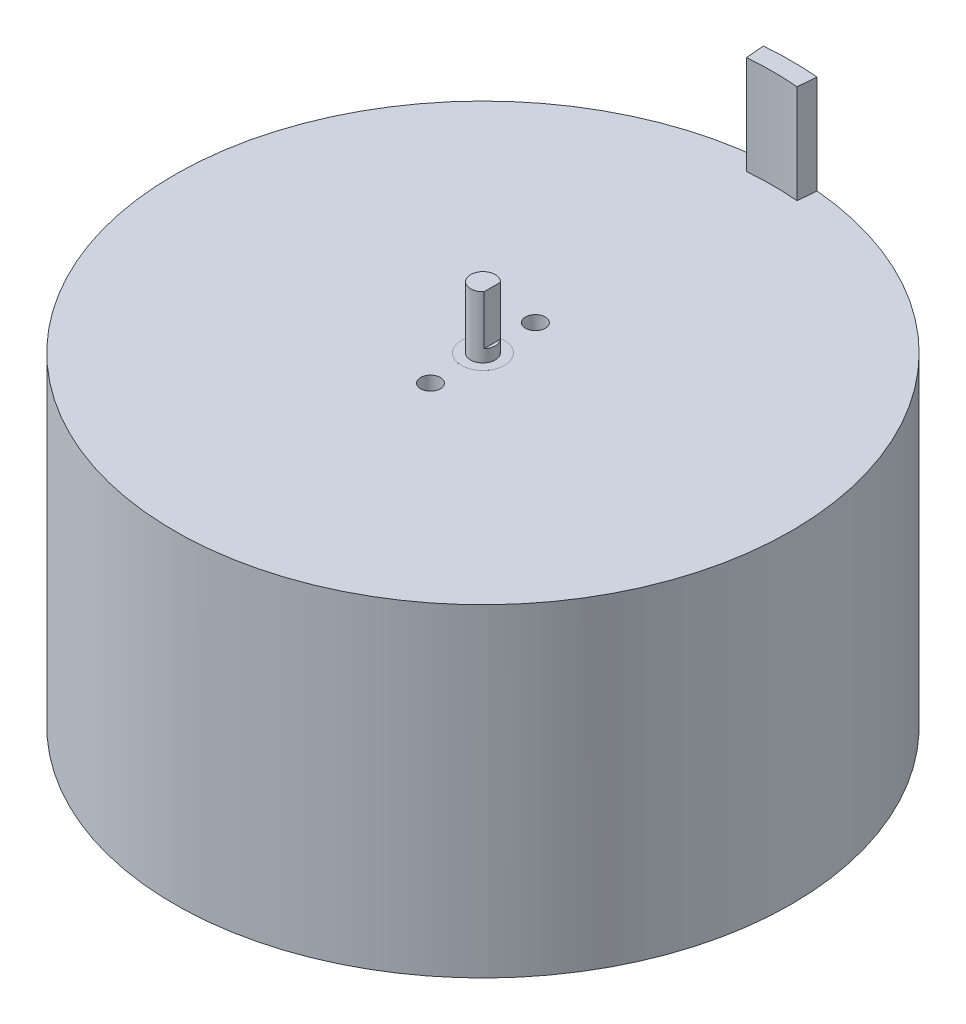
ISO-10303-21;
HEADER;
FILE_DESCRIPTION(('STEP AP214'),'2;1');
FILE_NAME('part.step','',(''),(''),'','','');
FILE_SCHEMA(('AUTOMOTIVE_DESIGN { 1 0 10303 214 1 1 1 1 }'));
ENDSEC;
DATA;
#1=APPLICATION_CONTEXT('core data for automotive mechanical design processes');
#2=APPLICATION_PROTOCOL_DEFINITION('international standard','automotive_design',2000,#1);
#3=PRODUCT_CONTEXT('',#1,'mechanical');
#4=PRODUCT('Part','Part','',(#3));
#5=PRODUCT_RELATED_PRODUCT_CATEGORY('part','',(#4));
#6=PRODUCT_DEFINITION_FORMATION('','',#4);
#7=PRODUCT_DEFINITION_CONTEXT('part definition',#1,'design');
#8=PRODUCT_DEFINITION('design','',#6,#7);
#9=PRODUCT_DEFINITION_SHAPE('','',#8);
#10=(LENGTH_UNIT() NAMED_UNIT(*) SI_UNIT(.MILLI.,.METRE.));
#11=(NAMED_UNIT(*) PLANE_ANGLE_UNIT() SI_UNIT($,.RADIAN.));
#12=(NAMED_UNIT(*) SI_UNIT($,.STERADIAN.) SOLID_ANGLE_UNIT());
#13=UNCERTAINTY_MEASURE_WITH_UNIT(LENGTH_MEASURE(1.E-05),#10,'distance_accuracy_value','');
#14=(GEOMETRIC_REPRESENTATION_CONTEXT(3) GLOBAL_UNCERTAINTY_ASSIGNED_CONTEXT((#13)) GLOBAL_UNIT_ASSIGNED_CONTEXT((#10,
#11,#12)) REPRESENTATION_CONTEXT('',''));
#15=CARTESIAN_POINT('',(0.,0.,0.));
#16=DIRECTION('',(0.,0.,1.));
#17=DIRECTION('',(1.,0.,0.));
#18=AXIS2_PLACEMENT_3D('',#15,#16,#17);
#19=CARTESIAN_POINT('',(-3.50000000000016,45.4,0.));
#20=DIRECTION('',(0.,1.,0.));
#21=DIRECTION('',(-1.,0.,0.));
#22=AXIS2_PLACEMENT_3D('',#19,#20,#21);
#23=PLANE('',#22);
#24=CARTESIAN_POINT('',(-1.58513252783478E-13,45.4,0.));
#25=DIRECTION('',(0.,1.,0.));
#26=DIRECTION('',(1.,0.,0.));
#27=AXIS2_PLACEMENT_3D('',#24,#25,#26);
#28=CIRCLE('',#27,3.5);
#29=CARTESIAN_POINT('',(3.49999999999984,45.4,0.));
#30=VERTEX_POINT('',#29);
#31=EDGE_CURVE('P0_E20',#30,#30,#28,.T.);
#32=ORIENTED_EDGE('',*,*,#31,.F.);
#33=EDGE_LOOP('',(#32));
#34=FACE_BOUND('',#33,.T.);
#35=CARTESIAN_POINT('',(-2.14225111316348E-13,45.4,8.5));
#36=DIRECTION('',(0.,1.,0.));
#37=DIRECTION('',(1.,0.,0.));
#38=AXIS2_PLACEMENT_3D('',#35,#36,#37);
#39=CIRCLE('',#38,1.6);
#40=CARTESIAN_POINT('',(1.59999999999979,45.4,8.5));
#41=VERTEX_POINT('',#40);
#42=EDGE_CURVE('P0_E93',#41,#41,#39,.T.);
#43=ORIENTED_EDGE('',*,*,#42,.F.);
#44=EDGE_LOOP('',(#43));
#45=FACE_BOUND('',#44,.T.);
#46=CARTESIAN_POINT('',(-1.62156577010942E-13,45.4,-8.5));
#47=DIRECTION('',(0.,1.,0.));
#48=DIRECTION('',(1.,0.,0.));
#49=AXIS2_PLACEMENT_3D('',#46,#47,#48);
#50=CIRCLE('',#49,1.6);
#51=CARTESIAN_POINT('',(1.59999999999984,45.4,-8.5));
#52=VERTEX_POINT('',#51);
#53=EDGE_CURVE('P0_E96',#52,#52,#50,.T.);
#54=ORIENTED_EDGE('',*,*,#53,.F.);
#55=EDGE_LOOP('',(#54));
#56=FACE_BOUND('',#55,.T.);
#57=DIRECTION('',(0.0871557427476586,0.,0.996194698091746));
#58=VECTOR('',#57,1.);
#59=CARTESIAN_POINT('',(-1.57649191618767E-13,45.4,0.));
#60=LINE('',#59,#58);
#61=CARTESIAN_POINT('',(-4.35778713738309,45.4,-49.8097349045873));
#62=VERTEX_POINT('',#61);
#63=CARTESIAN_POINT('',(-4.09631990914011,45.4,-46.821150810312));
#64=VERTEX_POINT('',#63);
#65=EDGE_CURVE('P0_E38',#62,#64,#60,.T.);
#66=ORIENTED_EDGE('',*,*,#65,.F.);
#67=CARTESIAN_POINT('',(-1.58513252783478E-13,45.4,0.));
#68=DIRECTION('',(0.,1.,0.));
#69=DIRECTION('',(1.,0.,0.));
#70=AXIS2_PLACEMENT_3D('',#67,#68,#69);
#71=CIRCLE('',#70,50.);
#72=CARTESIAN_POINT('',(4.35778713738277,45.4,-49.8097349045873));
#73=VERTEX_POINT('',#72);
#74=EDGE_CURVE('P0_E25',#62,#73,#71,.T.);
#75=ORIENTED_EDGE('',*,*,#74,.T.);
#76=DIRECTION('',(-0.0871557427476586,0.,0.996194698091746));
#77=VECTOR('',#76,1.);
#78=CARTESIAN_POINT('',(-1.5937731394819E-13,45.4,0.));
#79=LINE('',#78,#77);
#80=CARTESIAN_POINT('',(4.0963199091398,45.4,-46.821150810312));
#81=VERTEX_POINT('',#80);
#82=EDGE_CURVE('P0_E77',#73,#81,#79,.T.);
#83=ORIENTED_EDGE('',*,*,#82,.T.);
#84=CARTESIAN_POINT('',(-1.58513252783478E-13,45.4,0.));
#85=DIRECTION('',(0.,1.,0.));
#86=DIRECTION('',(1.,0.,0.));
#87=AXIS2_PLACEMENT_3D('',#84,#85,#86);
#88=CIRCLE('',#87,47.);
#89=EDGE_CURVE('P0_E33',#64,#81,#88,.F.);
#90=ORIENTED_EDGE('',*,*,#89,.F.);
#91=EDGE_LOOP('',(#66,#75,#83,#90));
#92=FACE_BOUND('',#91,.T.);
#93=ADVANCED_FACE('P0_F16',(#34,#45,#56,#92),#23,.T.);
#94=CARTESIAN_POINT('',(-1.50133697570255E-13,43.,0.));
#95=DIRECTION('',(0.,1.,0.));
#96=DIRECTION('',(1.,0.,0.));
#97=AXIS2_PLACEMENT_3D('',#94,#95,#96);
#98=PLANE('',#97);
#99=CARTESIAN_POINT('',(-1.50133697570255E-13,43.,0.));
#100=DIRECTION('',(0.,1.,0.));
#101=DIRECTION('',(1.,0.,0.));
#102=AXIS2_PLACEMENT_3D('',#99,#100,#101);
#103=CIRCLE('',#102,3.5);
#104=CARTESIAN_POINT('',(3.49999999999985,43.,0.));
#105=VERTEX_POINT('',#104);
#106=EDGE_CURVE('P0_E92',#105,#105,#103,.T.);
#107=ORIENTED_EDGE('',*,*,#106,.T.);
#108=EDGE_LOOP('',(#107));
#109=FACE_BOUND('',#108,.T.);
#110=CARTESIAN_POINT('',(-1.53777021797718E-13,43.,-8.5));
#111=DIRECTION('',(0.,1.,0.));
#112=DIRECTION('',(1.,0.,0.));
#113=AXIS2_PLACEMENT_3D('',#110,#111,#112);
#114=CIRCLE('',#113,1.6);
#115=CARTESIAN_POINT('',(1.59999999999985,43.,-8.5));
#116=VERTEX_POINT('',#115);
#117=EDGE_CURVE('P0_E102',#116,#116,#114,.T.);
#118=ORIENTED_EDGE('',*,*,#117,.T.);
#119=EDGE_LOOP('',(#118));
#120=FACE_BOUND('',#119,.T.);
#121=CARTESIAN_POINT('',(-2.05845556103125E-13,43.,8.5));
#122=DIRECTION('',(0.,1.,0.));
#123=DIRECTION('',(1.,0.,0.));
#124=AXIS2_PLACEMENT_3D('',#121,#122,#123);
#125=CIRCLE('',#124,1.6);
#126=CARTESIAN_POINT('',(1.59999999999979,43.,8.5));
#127=VERTEX_POINT('',#126);
#128=EDGE_CURVE('P0_E99',#127,#127,#125,.T.);
#129=ORIENTED_EDGE('',*,*,#128,.T.);
#130=EDGE_LOOP('',(#129));
#131=FACE_BOUND('',#130,.T.);
#132=CARTESIAN_POINT('',(-1.50133697570255E-13,43.,0.));
#133=DIRECTION('',(0.,1.,0.));
#134=DIRECTION('',(1.,0.,0.));
#135=AXIS2_PLACEMENT_3D('',#132,#133,#134);
#136=CIRCLE('',#135,17.5);
#137=CARTESIAN_POINT('',(17.4999999999999,43.0000000000001,0.));
#138=VERTEX_POINT('',#137);
#139=EDGE_CURVE('P0_E10',#138,#138,#136,.T.);
#140=ORIENTED_EDGE('',*,*,#139,.F.);
#141=EDGE_LOOP('',(#140));
#142=FACE_BOUND('',#141,.T.);
#143=ADVANCED_FACE('P0_F107',(#109,#120,#131,#142),#98,.F.);
#144=CARTESIAN_POINT('',(-6.55926603227395E-13,186.821356237309,-8.5));
#145=DIRECTION('',(0.,-1.,0.));
#146=DIRECTION('',(-1.,0.,0.));
#147=AXIS2_PLACEMENT_3D('',#144,#145,#146);
#148=CYLINDRICAL_SURFACE('',#147,1.6);
#149=ORIENTED_EDGE('',*,*,#117,.F.);
#150=EDGE_LOOP('',(#149));
#151=FACE_BOUND('',#150,.T.);
#152=ORIENTED_EDGE('',*,*,#53,.T.);
#153=EDGE_LOOP('',(#152));
#154=FACE_BOUND('',#153,.T.);
#155=ADVANCED_FACE('P0_F125',(#151,#154),#148,.F.);
#156=CARTESIAN_POINT('',(-7.07995137532801E-13,186.821356237309,8.5));
#157=DIRECTION('',(0.,-1.,0.));
#158=DIRECTION('',(-1.,0.,0.));
#159=AXIS2_PLACEMENT_3D('',#156,#157,#158);
#160=CYLINDRICAL_SURFACE('',#159,1.6);
#161=ORIENTED_EDGE('',*,*,#128,.F.);
#162=EDGE_LOOP('',(#161));
#163=FACE_BOUND('',#162,.T.);
#164=ORIENTED_EDGE('',*,*,#42,.T.);
#165=EDGE_LOOP('',(#164));
#166=FACE_BOUND('',#165,.T.);
#167=ADVANCED_FACE('P0_F127',(#163,#166),#160,.F.);
#168=CARTESIAN_POINT('',(-6.52283278999931E-13,186.821356237309,0.));
#169=DIRECTION('',(0.,-1.,0.));
#170=DIRECTION('',(-1.,0.,0.));
#171=AXIS2_PLACEMENT_3D('',#168,#169,#170);
#172=CYLINDRICAL_SURFACE('',#171,50.);
#173=ORIENTED_EDGE('',*,*,#74,.F.);
#174=DIRECTION('',(0.,-1.,0.));
#175=VECTOR('',#174,1.);
#176=CARTESIAN_POINT('',(-4.35778713738315,61.4,-49.8097349045873));
#177=LINE('',#176,#175);
#178=CARTESIAN_POINT('',(-4.35778713738315,61.4,-49.8097349045873));
#179=VERTEX_POINT('',#178);
#180=EDGE_CURVE('P0_E239',#179,#62,#177,.T.);
#181=ORIENTED_EDGE('',*,*,#180,.F.);
#182=CARTESIAN_POINT('',(-2.14376954204968E-13,61.4,0.));
#183=DIRECTION('',(0.,1.,0.));
#184=DIRECTION('',(1.,0.,0.));
#185=AXIS2_PLACEMENT_3D('',#182,#183,#184);
#186=CIRCLE('',#185,50.);
#187=CARTESIAN_POINT('',(4.35778713738272,61.4,-49.8097349045873));
#188=VERTEX_POINT('',#187);
#189=EDGE_CURVE('P0_E73',#188,#179,#186,.T.);
#190=ORIENTED_EDGE('',*,*,#189,.F.);
#191=DIRECTION('',(0.,-1.,0.));
#192=VECTOR('',#191,1.);
#193=CARTESIAN_POINT('',(4.35778713738272,61.4,-49.8097349045873));
#194=LINE('',#193,#192);
#195=EDGE_CURVE('P0_E85',#188,#73,#194,.T.);
#196=ORIENTED_EDGE('',*,*,#195,.T.);
#197=EDGE_LOOP('',(#173,#181,#190,#196));
#198=FACE_BOUND('',#197,.T.);
#199=CARTESIAN_POINT('',(0.,-7.00000000000003,0.));
#200=DIRECTION('',(0.,1.,0.));
#201=DIRECTION('',(1.,0.,0.));
#202=AXIS2_PLACEMENT_3D('',#199,#200,#201);
#203=CIRCLE('',#202,50.);
#204=CARTESIAN_POINT('',(50.,-6.99999999999986,0.));
#205=VERTEX_POINT('',#204);
#206=EDGE_CURVE('P0_E83',#205,#205,#203,.T.);
#207=ORIENTED_EDGE('',*,*,#206,.T.);
#208=EDGE_LOOP('',(#207));
#209=FACE_BOUND('',#208,.T.);
#210=ADVANCED_FACE('P0_F18',(#198,#209),#172,.T.);
#211=CARTESIAN_POINT('',(-6.52283278999931E-13,186.821356237309,0.));
#212=DIRECTION('',(0.,-1.,0.));
#213=DIRECTION('',(-1.,0.,0.));
#214=AXIS2_PLACEMENT_3D('',#211,#212,#213);
#215=CYLINDRICAL_SURFACE('',#214,3.5);
#216=ORIENTED_EDGE('',*,*,#106,.F.);
#217=EDGE_LOOP('',(#216));
#218=FACE_BOUND('',#217,.T.);
#219=ORIENTED_EDGE('',*,*,#31,.T.);
#220=EDGE_LOOP('',(#219));
#221=FACE_BOUND('',#220,.T.);
#222=ADVANCED_FACE('P0_F110',(#218,#221),#215,.F.);
#223=CARTESIAN_POINT('',(0.,-7.00000000000003,0.));
#224=DIRECTION('',(0.,1.,0.));
#225=DIRECTION('',(1.,0.,0.));
#226=AXIS2_PLACEMENT_3D('',#223,#224,#225);
#227=CYLINDRICAL_SURFACE('',#226,17.5);
#228=CARTESIAN_POINT('',(0.,-7.00000000000003,0.));
#229=DIRECTION('',(0.,1.,0.));
#230=DIRECTION('',(1.,0.,0.));
#231=AXIS2_PLACEMENT_3D('',#228,#229,#230);
#232=CIRCLE('',#231,17.5);
#233=CARTESIAN_POINT('',(17.5,-6.99999999999997,0.));
#234=VERTEX_POINT('',#233);
#235=EDGE_CURVE('P0_E80',#234,#234,#232,.T.);
#236=ORIENTED_EDGE('',*,*,#235,.F.);
#237=EDGE_LOOP('',(#236));
#238=FACE_BOUND('',#237,.T.);
#239=ORIENTED_EDGE('',*,*,#139,.T.);
#240=EDGE_LOOP('',(#239));
#241=FACE_BOUND('',#240,.T.);
#242=ADVANCED_FACE('P0_F113',(#238,#241),#227,.F.);
#243=CARTESIAN_POINT('',(0.,-7.00000000000003,0.));
#244=DIRECTION('',(0.,1.,0.));
#245=DIRECTION('',(1.,0.,0.));
#246=AXIS2_PLACEMENT_3D('',#243,#244,#245);
#247=PLANE('',#246);
#248=ORIENTED_EDGE('',*,*,#235,.T.);
#249=EDGE_LOOP('',(#248));
#250=FACE_BOUND('',#249,.T.);
#251=ORIENTED_EDGE('',*,*,#206,.F.);
#252=EDGE_LOOP('',(#251));
#253=FACE_BOUND('',#252,.T.);
#254=ADVANCED_FACE('P0_F141',(#250,#253),#247,.F.);
#255=CARTESIAN_POINT('',(-2.13512893040257E-13,61.4,0.));
#256=DIRECTION('',(0.996194698091746,0.,-0.0871557427476586));
#257=DIRECTION('',(-0.0871557427476586,0.,-0.996194698091746));
#258=AXIS2_PLACEMENT_3D('',#255,#256,#257);
#259=PLANE('',#258);
#260=ORIENTED_EDGE('',*,*,#65,.T.);
#261=DIRECTION('',(0.,-1.,0.));
#262=VECTOR('',#261,1.);
#263=CARTESIAN_POINT('',(-4.09631990914017,61.4,-46.821150810312));
#264=LINE('',#263,#262);
#265=CARTESIAN_POINT('',(-4.09631990914017,61.4,-46.821150810312));
#266=VERTEX_POINT('',#265);
#267=EDGE_CURVE('P0_E61',#266,#64,#264,.T.);
#268=ORIENTED_EDGE('',*,*,#267,.F.);
#269=DIRECTION('',(0.0871557427476586,0.,0.996194698091746));
#270=VECTOR('',#269,1.);
#271=CARTESIAN_POINT('',(-2.13512893040257E-13,61.4,0.));
#272=LINE('',#271,#270);
#273=EDGE_CURVE('P0_E68',#179,#266,#272,.T.);
#274=ORIENTED_EDGE('',*,*,#273,.F.);
#275=ORIENTED_EDGE('',*,*,#180,.T.);
#276=EDGE_LOOP('',(#260,#268,#274,#275));
#277=FACE_BOUND('',#276,.T.);
#278=ADVANCED_FACE('P0_F79',(#277),#259,.F.);
#279=CARTESIAN_POINT('',(-2.14376954204968E-13,61.4,0.));
#280=DIRECTION('',(0.,-1.,0.));
#281=DIRECTION('',(-1.,0.,0.));
#282=AXIS2_PLACEMENT_3D('',#279,#280,#281);
#283=CYLINDRICAL_SURFACE('',#282,47.);
#284=ORIENTED_EDGE('',*,*,#89,.T.);
#285=DIRECTION('',(0.,-1.,0.));
#286=VECTOR('',#285,1.);
#287=CARTESIAN_POINT('',(4.09631990913974,61.4,-46.821150810312));
#288=LINE('',#287,#286);
#289=CARTESIAN_POINT('',(4.09631990913974,61.4,-46.821150810312));
#290=VERTEX_POINT('',#289);
#291=EDGE_CURVE('P0_E63',#290,#81,#288,.T.);
#292=ORIENTED_EDGE('',*,*,#291,.F.);
#293=CARTESIAN_POINT('',(-2.14376954204968E-13,61.4,0.));
#294=DIRECTION('',(0.,1.,0.));
#295=DIRECTION('',(1.,0.,0.));
#296=AXIS2_PLACEMENT_3D('',#293,#294,#295);
#297=CIRCLE('',#296,47.);
#298=EDGE_CURVE('P0_E57',#266,#290,#297,.F.);
#299=ORIENTED_EDGE('',*,*,#298,.F.);
#300=ORIENTED_EDGE('',*,*,#267,.T.);
#301=EDGE_LOOP('',(#284,#292,#299,#300));
#302=FACE_BOUND('',#301,.T.);
#303=ADVANCED_FACE('P0_F59',(#302),#283,.F.);
#304=CARTESIAN_POINT('',(-2.1524101536968E-13,61.4,0.));
#305=DIRECTION('',(0.996194698091746,0.,0.0871557427476586));
#306=DIRECTION('',(0.0871557427476586,0.,-0.996194698091746));
#307=AXIS2_PLACEMENT_3D('',#304,#305,#306);
#308=PLANE('',#307);
#309=ORIENTED_EDGE('',*,*,#82,.F.);
#310=ORIENTED_EDGE('',*,*,#195,.F.);
#311=DIRECTION('',(-0.0871557427476586,0.,0.996194698091746));
#312=VECTOR('',#311,1.);
#313=CARTESIAN_POINT('',(-2.1524101536968E-13,61.4,0.));
#314=LINE('',#313,#312);
#315=EDGE_CURVE('P0_E67',#188,#290,#314,.T.);
#316=ORIENTED_EDGE('',*,*,#315,.T.);
#317=ORIENTED_EDGE('',*,*,#291,.T.);
#318=EDGE_LOOP('',(#309,#310,#316,#317));
#319=FACE_BOUND('',#318,.T.);
#320=ADVANCED_FACE('P0_F150',(#319),#308,.T.);
#321=CARTESIAN_POINT('',(-2.14376954204968E-13,61.4,0.));
#322=DIRECTION('',(0.,1.,0.));
#323=DIRECTION('',(1.,0.,0.));
#324=AXIS2_PLACEMENT_3D('',#321,#322,#323);
#325=PLANE('',#324);
#326=ORIENTED_EDGE('',*,*,#273,.T.);
#327=ORIENTED_EDGE('',*,*,#298,.T.);
#328=ORIENTED_EDGE('',*,*,#315,.F.);
#329=ORIENTED_EDGE('',*,*,#189,.T.);
#330=EDGE_LOOP('',(#326,#327,#328,#329));
#331=FACE_BOUND('',#330,.T.);
#332=ADVANCED_FACE('P0_F71',(#331),#325,.T.);
#333=CLOSED_SHELL('',(#93,#143,#155,#167,#210,#222,#242,#254,#278,#303,#320,#332));
#334=MANIFOLD_SOLID_BREP('P0_B1',#333);
#335=CARTESIAN_POINT('',(-2.00000000000019,55.4,0.));
#336=DIRECTION('',(0.,1.,0.));
#337=DIRECTION('',(-1.,0.,0.));
#338=AXIS2_PLACEMENT_3D('',#335,#336,#337);
#339=PLANE('',#338);
#340=DIRECTION('',(0.,0.,1.));
#341=VECTOR('',#340,1.);
#342=CARTESIAN_POINT('',(1.49999999999981,55.4,0.));
#343=LINE('',#342,#341);
#344=CARTESIAN_POINT('',(1.49999999999981,55.4,-1.32287565553229));
#345=VERTEX_POINT('',#344);
#346=CARTESIAN_POINT('',(1.49999999999981,55.4,1.32287565553229));
#347=VERTEX_POINT('',#346);
#348=EDGE_CURVE('P1_E45',#345,#347,#343,.T.);
#349=ORIENTED_EDGE('',*,*,#348,.F.);
#350=CARTESIAN_POINT('',(-1.9342806617191E-13,55.4,0.));
#351=DIRECTION('',(0.,1.,0.));
#352=DIRECTION('',(-1.,0.,0.));
#353=AXIS2_PLACEMENT_3D('',#350,#351,#352);
#354=CIRCLE('',#353,2.);
#355=EDGE_CURVE('P1_E53',#345,#347,#354,.T.);
#356=ORIENTED_EDGE('',*,*,#355,.T.);
#357=EDGE_LOOP('',(#349,#356));
#358=FACE_BOUND('',#357,.T.);
#359=ADVANCED_FACE('P1_F17',(#358),#339,.T.);
#360=CARTESIAN_POINT('',(-12.5,0.,0.));
#361=DIRECTION('',(0.,-1.,0.));
#362=DIRECTION('',(1.,0.,0.));
#363=AXIS2_PLACEMENT_3D('',#360,#361,#362);
#364=PLANE('',#363);
#365=CARTESIAN_POINT('',(0.,0.,0.));
#366=DIRECTION('',(0.,1.,0.));
#367=DIRECTION('',(-1.,0.,0.));
#368=AXIS2_PLACEMENT_3D('',#365,#366,#367);
#369=CIRCLE('',#368,12.5);
#370=CARTESIAN_POINT('',(-12.5,0.,0.));
#371=VERTEX_POINT('',#370);
#372=EDGE_CURVE('P1_E11',#371,#371,#369,.T.);
#373=ORIENTED_EDGE('',*,*,#372,.F.);
#374=EDGE_LOOP('',(#373));
#375=FACE_BOUND('',#374,.T.);
#376=ADVANCED_FACE('P1_F82',(#375),#364,.T.);
#377=CARTESIAN_POINT('',(-1.9342806617191E-13,55.4,0.));
#378=DIRECTION('',(0.,1.,0.));
#379=DIRECTION('',(-1.,0.,0.));
#380=AXIS2_PLACEMENT_3D('',#377,#378,#379);
#381=CYLINDRICAL_SURFACE('',#380,12.5);
#382=ORIENTED_EDGE('',*,*,#372,.T.);
#383=EDGE_LOOP('',(#382));
#384=FACE_BOUND('',#383,.T.);
#385=CARTESIAN_POINT('',(-1.50133697570255E-13,43.,0.));
#386=DIRECTION('',(0.,1.,0.));
#387=DIRECTION('',(-1.,0.,0.));
#388=AXIS2_PLACEMENT_3D('',#385,#386,#387);
#389=CIRCLE('',#388,12.5);
#390=CARTESIAN_POINT('',(-12.5000000000001,43.,0.));
#391=VERTEX_POINT('',#390);
#392=EDGE_CURVE('P1_E24',#391,#391,#389,.T.);
#393=ORIENTED_EDGE('',*,*,#392,.F.);
#394=EDGE_LOOP('',(#393));
#395=FACE_BOUND('',#394,.T.);
#396=ADVANCED_FACE('P1_F80',(#384,#395),#381,.T.);
#397=CARTESIAN_POINT('',(-12.5000000000001,43.,0.));
#398=DIRECTION('',(0.,1.,0.));
#399=DIRECTION('',(-1.,0.,0.));
#400=AXIS2_PLACEMENT_3D('',#397,#398,#399);
#401=PLANE('',#400);
#402=CARTESIAN_POINT('',(-1.53777021797718E-13,43.,-8.5));
#403=DIRECTION('',(0.,1.,0.));
#404=DIRECTION('',(-1.,0.,0.));
#405=AXIS2_PLACEMENT_3D('',#402,#403,#404);
#406=CIRCLE('',#405,1.6);
#407=CARTESIAN_POINT('',(-1.60000000000015,43.,-8.5));
#408=VERTEX_POINT('',#407);
#409=EDGE_CURVE('P1_E64',#408,#408,#406,.T.);
#410=ORIENTED_EDGE('',*,*,#409,.F.);
#411=EDGE_LOOP('',(#410));
#412=FACE_BOUND('',#411,.T.);
#413=CARTESIAN_POINT('',(-2.05845556103125E-13,43.,8.5));
#414=DIRECTION('',(0.,1.,0.));
#415=DIRECTION('',(-1.,0.,0.));
#416=AXIS2_PLACEMENT_3D('',#413,#414,#415);
#417=CIRCLE('',#416,1.6);
#418=CARTESIAN_POINT('',(-1.60000000000021,43.,8.5));
#419=VERTEX_POINT('',#418);
#420=EDGE_CURVE('P1_E67',#419,#419,#417,.T.);
#421=ORIENTED_EDGE('',*,*,#420,.F.);
#422=EDGE_LOOP('',(#421));
#423=FACE_BOUND('',#422,.T.);
#424=ORIENTED_EDGE('',*,*,#392,.T.);
#425=EDGE_LOOP('',(#424));
#426=FACE_BOUND('',#425,.T.);
#427=CARTESIAN_POINT('',(-1.50133697570255E-13,43.,0.));
#428=DIRECTION('',(0.,1.,0.));
#429=DIRECTION('',(-1.,0.,0.));
#430=AXIS2_PLACEMENT_3D('',#427,#428,#429);
#431=CIRCLE('',#430,3.5);
#432=CARTESIAN_POINT('',(-3.50000000000015,43.,0.));
#433=VERTEX_POINT('',#432);
#434=EDGE_CURVE('P1_E72',#433,#433,#431,.T.);
#435=ORIENTED_EDGE('',*,*,#434,.F.);
#436=EDGE_LOOP('',(#435));
#437=FACE_BOUND('',#436,.T.);
#438=ADVANCED_FACE('P1_F77',(#412,#423,#426,#437),#401,.T.);
#439=CARTESIAN_POINT('',(-1.9342806617191E-13,55.4,0.));
#440=DIRECTION('',(0.,1.,0.));
#441=DIRECTION('',(-1.,0.,0.));
#442=AXIS2_PLACEMENT_3D('',#439,#440,#441);
#443=CYLINDRICAL_SURFACE('',#442,3.5);
#444=ORIENTED_EDGE('',*,*,#434,.T.);
#445=EDGE_LOOP('',(#444));
#446=FACE_BOUND('',#445,.T.);
#447=CARTESIAN_POINT('',(-1.58513252783478E-13,45.4,0.));
#448=DIRECTION('',(0.,1.,0.));
#449=DIRECTION('',(-1.,0.,0.));
#450=AXIS2_PLACEMENT_3D('',#447,#448,#449);
#451=CIRCLE('',#450,3.5);
#452=CARTESIAN_POINT('',(-3.50000000000016,45.4,0.));
#453=VERTEX_POINT('',#452);
#454=EDGE_CURVE('P1_E61',#453,#453,#451,.T.);
#455=ORIENTED_EDGE('',*,*,#454,.F.);
#456=EDGE_LOOP('',(#455));
#457=FACE_BOUND('',#456,.T.);
#458=ADVANCED_FACE('P1_F91',(#446,#457),#443,.T.);
#459=CARTESIAN_POINT('',(-3.50000000000016,45.4,0.));
#460=DIRECTION('',(0.,1.,0.));
#461=DIRECTION('',(-1.,0.,0.));
#462=AXIS2_PLACEMENT_3D('',#459,#460,#461);
#463=PLANE('',#462);
#464=ORIENTED_EDGE('',*,*,#454,.T.);
#465=EDGE_LOOP('',(#464));
#466=FACE_BOUND('',#465,.T.);
#467=CARTESIAN_POINT('',(-1.58513252783478E-13,45.4,0.));
#468=DIRECTION('',(0.,1.,0.));
#469=DIRECTION('',(-1.,0.,0.));
#470=AXIS2_PLACEMENT_3D('',#467,#468,#469);
#471=CIRCLE('',#470,2.);
#472=CARTESIAN_POINT('',(-2.00000000000016,45.4,0.));
#473=VERTEX_POINT('',#472);
#474=EDGE_CURVE('P1_E57',#473,#473,#471,.T.);
#475=ORIENTED_EDGE('',*,*,#474,.F.);
#476=EDGE_LOOP('',(#475));
#477=FACE_BOUND('',#476,.T.);
#478=ADVANCED_FACE('P1_F127',(#466,#477),#463,.T.);
#479=CARTESIAN_POINT('',(-1.9342806617191E-13,55.4,0.));
#480=DIRECTION('',(0.,1.,0.));
#481=DIRECTION('',(-1.,0.,0.));
#482=AXIS2_PLACEMENT_3D('',#479,#480,#481);
#483=CYLINDRICAL_SURFACE('',#482,2.);
#484=DIRECTION('',(0.,1.,0.));
#485=VECTOR('',#484,1.);
#486=CARTESIAN_POINT('',(1.49999999999983,47.4,1.32287565553229));
#487=LINE('',#486,#485);
#488=CARTESIAN_POINT('',(1.49999999999983,47.4,1.32287565553229));
#489=VERTEX_POINT('',#488);
#490=EDGE_CURVE('P1_E49',#489,#347,#487,.T.);
#491=ORIENTED_EDGE('',*,*,#490,.T.);
#492=ORIENTED_EDGE('',*,*,#355,.F.);
#493=DIRECTION('',(0.,1.,0.));
#494=VECTOR('',#493,1.);
#495=CARTESIAN_POINT('',(1.49999999999983,47.4,-1.32287565553229));
#496=LINE('',#495,#494);
#497=CARTESIAN_POINT('',(1.49999999999983,47.4,-1.32287565553229));
#498=VERTEX_POINT('',#497);
#499=EDGE_CURVE('P1_E42',#498,#345,#496,.T.);
#500=ORIENTED_EDGE('',*,*,#499,.F.);
#501=CARTESIAN_POINT('',(-1.65496215461164E-13,47.4,0.));
#502=DIRECTION('',(0.,1.,0.));
#503=DIRECTION('',(-1.,0.,0.));
#504=AXIS2_PLACEMENT_3D('',#501,#502,#503);
#505=CIRCLE('',#504,2.);
#506=EDGE_CURVE('P1_E35',#489,#498,#505,.T.);
#507=ORIENTED_EDGE('',*,*,#506,.F.);
#508=EDGE_LOOP('',(#491,#492,#500,#507));
#509=FACE_BOUND('',#508,.T.);
#510=ORIENTED_EDGE('',*,*,#474,.T.);
#511=EDGE_LOOP('',(#510));
#512=FACE_BOUND('',#511,.T.);
#513=ADVANCED_FACE('P1_F55',(#509,#512),#483,.T.);
#514=CARTESIAN_POINT('',(-1.88388149408909E-13,38.,8.5));
#515=DIRECTION('',(0.,1.,0.));
#516=DIRECTION('',(-1.,0.,0.));
#517=AXIS2_PLACEMENT_3D('',#514,#515,#516);
#518=CYLINDRICAL_SURFACE('',#517,1.6);
#519=CARTESIAN_POINT('',(-1.88388149408909E-13,38.,8.5));
#520=DIRECTION('',(0.,1.,0.));
#521=DIRECTION('',(-1.,0.,0.));
#522=AXIS2_PLACEMENT_3D('',#519,#520,#521);
#523=CIRCLE('',#522,1.6);
#524=CARTESIAN_POINT('',(-1.60000000000019,38.,8.5));
#525=VERTEX_POINT('',#524);
#526=EDGE_CURVE('P1_E212',#525,#525,#523,.T.);
#527=ORIENTED_EDGE('',*,*,#526,.F.);
#528=EDGE_LOOP('',(#527));
#529=FACE_BOUND('',#528,.T.);
#530=ORIENTED_EDGE('',*,*,#420,.T.);
#531=EDGE_LOOP('',(#530));
#532=FACE_BOUND('',#531,.T.);
#533=ADVANCED_FACE('P1_F147',(#529,#532),#518,.F.);
#534=CARTESIAN_POINT('',(-1.33664132112238E-13,38.,0.));
#535=DIRECTION('',(0.,1.,0.));
#536=DIRECTION('',(-1.,0.,0.));
#537=AXIS2_PLACEMENT_3D('',#534,#535,#536);
#538=PLANE('',#537);
#539=ORIENTED_EDGE('',*,*,#526,.T.);
#540=EDGE_LOOP('',(#539));
#541=FACE_BOUND('',#540,.T.);
#542=ADVANCED_FACE('P1_F156',(#541),#538,.T.);
#543=CARTESIAN_POINT('',(-1.36319615103502E-13,38.,-8.5));
#544=DIRECTION('',(0.,1.,0.));
#545=DIRECTION('',(-1.,0.,0.));
#546=AXIS2_PLACEMENT_3D('',#543,#544,#545);
#547=CYLINDRICAL_SURFACE('',#546,1.6);
#548=CARTESIAN_POINT('',(-1.36319615103502E-13,38.,-8.5));
#549=DIRECTION('',(0.,1.,0.));
#550=DIRECTION('',(-1.,0.,0.));
#551=AXIS2_PLACEMENT_3D('',#548,#549,#550);
#552=CIRCLE('',#551,1.6);
#553=CARTESIAN_POINT('',(-1.60000000000014,38.,-8.5));
#554=VERTEX_POINT('',#553);
#555=EDGE_CURVE('P1_E58',#554,#554,#552,.T.);
#556=ORIENTED_EDGE('',*,*,#555,.F.);
#557=EDGE_LOOP('',(#556));
#558=FACE_BOUND('',#557,.T.);
#559=ORIENTED_EDGE('',*,*,#409,.T.);
#560=EDGE_LOOP('',(#559));
#561=FACE_BOUND('',#560,.T.);
#562=ADVANCED_FACE('P1_F166',(#558,#561),#547,.F.);
#563=CARTESIAN_POINT('',(-1.33664132112238E-13,38.,0.));
#564=DIRECTION('',(0.,1.,0.));
#565=DIRECTION('',(-1.,0.,0.));
#566=AXIS2_PLACEMENT_3D('',#563,#564,#565);
#567=PLANE('',#566);
#568=ORIENTED_EDGE('',*,*,#555,.T.);
#569=EDGE_LOOP('',(#568));
#570=FACE_BOUND('',#569,.T.);
#571=ADVANCED_FACE('P1_F176',(#570),#567,.T.);
#572=CARTESIAN_POINT('',(1.49999999999983,47.4,0.));
#573=DIRECTION('',(-1.,0.,0.));
#574=DIRECTION('',(0.,-1.,0.));
#575=AXIS2_PLACEMENT_3D('',#572,#573,#574);
#576=PLANE('',#575);
#577=ORIENTED_EDGE('',*,*,#348,.T.);
#578=ORIENTED_EDGE('',*,*,#490,.F.);
#579=DIRECTION('',(0.,0.,1.));
#580=VECTOR('',#579,1.);
#581=CARTESIAN_POINT('',(1.49999999999983,47.4,0.));
#582=LINE('',#581,#580);
#583=EDGE_CURVE('P1_E30',#498,#489,#582,.T.);
#584=ORIENTED_EDGE('',*,*,#583,.F.);
#585=ORIENTED_EDGE('',*,*,#499,.T.);
#586=EDGE_LOOP('',(#577,#578,#584,#585));
#587=FACE_BOUND('',#586,.T.);
#588=ADVANCED_FACE('P1_F44',(#587),#576,.F.);
#589=CARTESIAN_POINT('',(-1.41360840771623E-13,47.4,0.));
#590=DIRECTION('',(0.,1.,0.));
#591=DIRECTION('',(-1.,0.,0.));
#592=AXIS2_PLACEMENT_3D('',#589,#590,#591);
#593=PLANE('',#592);
#594=ORIENTED_EDGE('',*,*,#506,.T.);
#595=ORIENTED_EDGE('',*,*,#583,.T.);
#596=EDGE_LOOP('',(#594,#595));
#597=FACE_BOUND('',#596,.T.);
#598=ADVANCED_FACE('P1_F195',(#597),#593,.T.);
#599=CLOSED_SHELL('',(#359,#376,#396,#438,#458,#478,#513,#533,#542,#562,#571,#588,#598));
#600=MANIFOLD_SOLID_BREP('P1_B1',#599);
#601=ADVANCED_BREP_SHAPE_REPRESENTATION('',(#18,#334,#600),#14);
#602=SHAPE_DEFINITION_REPRESENTATION(#9,#601);
ENDSEC;
END-ISO-10303-21;
